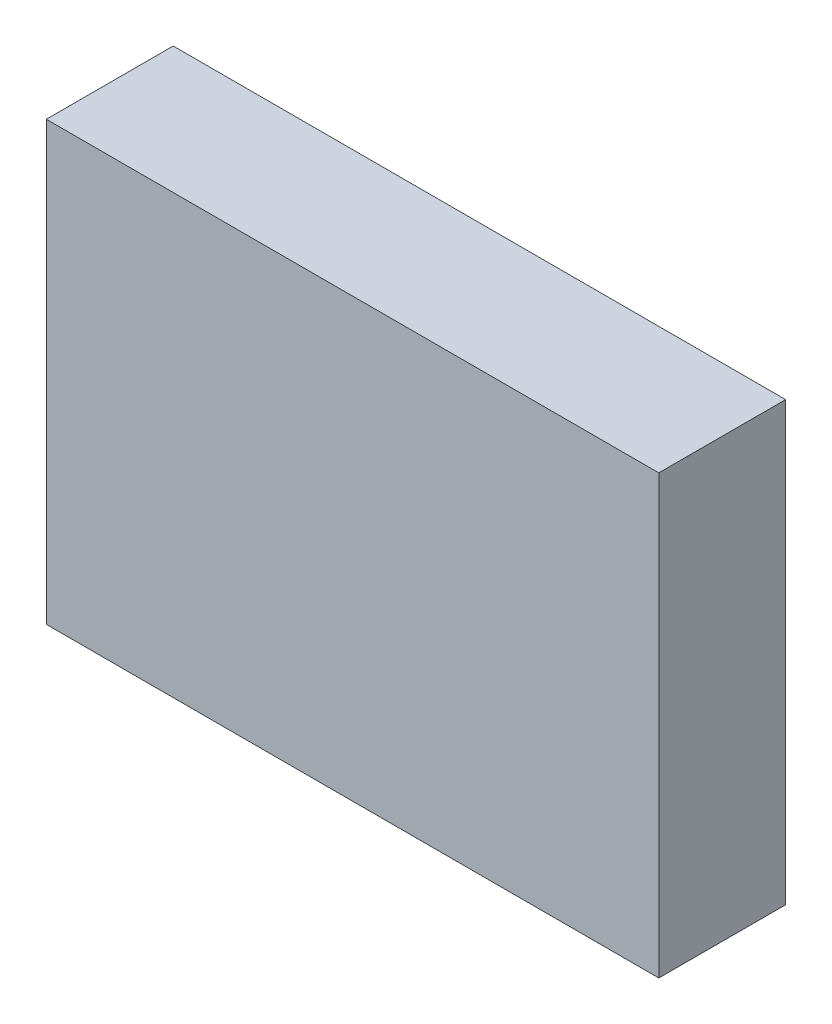
ISO-10303-21;
HEADER;
FILE_DESCRIPTION(('STEP AP214'),'2;1');
FILE_NAME('part.step','',(''),(''),'','','');
FILE_SCHEMA(('AUTOMOTIVE_DESIGN { 1 0 10303 214 1 1 1 1 }'));
ENDSEC;
DATA;
#1=APPLICATION_CONTEXT('core data for automotive mechanical design processes');
#2=APPLICATION_PROTOCOL_DEFINITION('international standard','automotive_design',2000,#1);
#3=PRODUCT_CONTEXT('',#1,'mechanical');
#4=PRODUCT('Part','Part','',(#3));
#5=PRODUCT_RELATED_PRODUCT_CATEGORY('part','',(#4));
#6=PRODUCT_DEFINITION_FORMATION('','',#4);
#7=PRODUCT_DEFINITION_CONTEXT('part definition',#1,'design');
#8=PRODUCT_DEFINITION('design','',#6,#7);
#9=PRODUCT_DEFINITION_SHAPE('','',#8);
#10=(LENGTH_UNIT() NAMED_UNIT(*) SI_UNIT(.MILLI.,.METRE.));
#11=(NAMED_UNIT(*) PLANE_ANGLE_UNIT() SI_UNIT($,.RADIAN.));
#12=(NAMED_UNIT(*) SI_UNIT($,.STERADIAN.) SOLID_ANGLE_UNIT());
#13=UNCERTAINTY_MEASURE_WITH_UNIT(LENGTH_MEASURE(1.E-05),#10,'distance_accuracy_value','');
#14=(GEOMETRIC_REPRESENTATION_CONTEXT(3) GLOBAL_UNCERTAINTY_ASSIGNED_CONTEXT((#13)) GLOBAL_UNIT_ASSIGNED_CONTEXT((#10,
#11,#12)) REPRESENTATION_CONTEXT('',''));
#15=CARTESIAN_POINT('',(0.,0.,0.));
#16=DIRECTION('',(0.,0.,1.));
#17=DIRECTION('',(1.,0.,0.));
#18=AXIS2_PLACEMENT_3D('',#15,#16,#17);
#19=CARTESIAN_POINT('',(-5.52112676056338,2.11424100156494,2.9));
#20=DIRECTION('',(1.,0.,0.));
#21=DIRECTION('',(0.,0.,-1.));
#22=AXIS2_PLACEMENT_3D('',#19,#20,#21);
#23=PLANE('',#22);
#24=DIRECTION('',(0.,-1.,0.));
#25=VECTOR('',#24,1.);
#26=CARTESIAN_POINT('',(-5.52112676056338,2.11424100156494,0.));
#27=LINE('',#26,#25);
#28=CARTESIAN_POINT('',(-5.52112676056338,2.11424100156494,0.));
#29=VERTEX_POINT('',#28);
#30=CARTESIAN_POINT('',(-5.52112676056338,-7.88575899843506,0.));
#31=VERTEX_POINT('',#30);
#32=EDGE_CURVE('E96',#29,#31,#27,.T.);
#33=ORIENTED_EDGE('',*,*,#32,.T.);
#34=DIRECTION('',(0.,0.,-1.));
#35=VECTOR('',#34,1.);
#36=CARTESIAN_POINT('',(-5.52112676056338,-7.88575899843506,2.9));
#37=LINE('',#36,#35);
#38=CARTESIAN_POINT('',(-5.52112676056338,-7.88575899843506,2.9));
#39=VERTEX_POINT('',#38);
#40=EDGE_CURVE('E11',#39,#31,#37,.T.);
#41=ORIENTED_EDGE('',*,*,#40,.F.);
#42=DIRECTION('',(0.,-1.,0.));
#43=VECTOR('',#42,1.);
#44=CARTESIAN_POINT('',(-5.52112676056338,2.11424100156494,2.9));
#45=LINE('',#44,#43);
#46=CARTESIAN_POINT('',(-5.52112676056338,2.11424100156494,2.9));
#47=VERTEX_POINT('',#46);
#48=EDGE_CURVE('E84',#47,#39,#45,.T.);
#49=ORIENTED_EDGE('',*,*,#48,.F.);
#50=DIRECTION('',(0.,0.,-1.));
#51=VECTOR('',#50,1.);
#52=CARTESIAN_POINT('',(-5.52112676056338,2.11424100156494,2.9));
#53=LINE('',#52,#51);
#54=EDGE_CURVE('E92',#47,#29,#53,.T.);
#55=ORIENTED_EDGE('',*,*,#54,.T.);
#56=EDGE_LOOP('',(#33,#41,#49,#55));
#57=FACE_BOUND('',#56,.T.);
#58=ADVANCED_FACE('F33',(#57),#23,.F.);
#59=CARTESIAN_POINT('',(-5.52112676056338,-7.88575899843506,2.9));
#60=DIRECTION('',(0.,1.,0.));
#61=DIRECTION('',(0.,0.,1.));
#62=AXIS2_PLACEMENT_3D('',#59,#60,#61);
#63=PLANE('',#62);
#64=DIRECTION('',(1.,0.,0.));
#65=VECTOR('',#64,1.);
#66=CARTESIAN_POINT('',(-5.52112676056338,-7.88575899843506,0.));
#67=LINE('',#66,#65);
#68=CARTESIAN_POINT('',(8.47887323943662,-7.88575899843506,0.));
#69=VERTEX_POINT('',#68);
#70=EDGE_CURVE('E88',#31,#69,#67,.T.);
#71=ORIENTED_EDGE('',*,*,#70,.T.);
#72=DIRECTION('',(0.,0.,-1.));
#73=VECTOR('',#72,1.);
#74=CARTESIAN_POINT('',(8.47887323943662,-7.88575899843506,2.9));
#75=LINE('',#74,#73);
#76=CARTESIAN_POINT('',(8.47887323943662,-7.88575899843506,2.9));
#77=VERTEX_POINT('',#76);
#78=EDGE_CURVE('E41',#77,#69,#75,.T.);
#79=ORIENTED_EDGE('',*,*,#78,.F.);
#80=DIRECTION('',(1.,0.,0.));
#81=VECTOR('',#80,1.);
#82=CARTESIAN_POINT('',(-5.52112676056338,-7.88575899843506,2.9));
#83=LINE('',#82,#81);
#84=EDGE_CURVE('E79',#39,#77,#83,.T.);
#85=ORIENTED_EDGE('',*,*,#84,.F.);
#86=ORIENTED_EDGE('',*,*,#40,.T.);
#87=EDGE_LOOP('',(#71,#79,#85,#86));
#88=FACE_BOUND('',#87,.T.);
#89=ADVANCED_FACE('F87',(#88),#63,.F.);
#90=CARTESIAN_POINT('',(8.47887323943662,2.11424100156494,2.9));
#91=DIRECTION('',(-1.,0.,0.));
#92=DIRECTION('',(0.,0.,1.));
#93=AXIS2_PLACEMENT_3D('',#90,#91,#92);
#94=PLANE('',#93);
#95=DIRECTION('',(0.,1.,0.));
#96=VECTOR('',#95,1.);
#97=CARTESIAN_POINT('',(8.47887323943662,2.11424100156494,0.));
#98=LINE('',#97,#96);
#99=CARTESIAN_POINT('',(8.47887323943662,2.11424100156494,0.));
#100=VERTEX_POINT('',#99);
#101=EDGE_CURVE('E66',#69,#100,#98,.T.);
#102=ORIENTED_EDGE('',*,*,#101,.T.);
#103=DIRECTION('',(0.,0.,-1.));
#104=VECTOR('',#103,1.);
#105=CARTESIAN_POINT('',(8.47887323943662,2.11424100156494,2.9));
#106=LINE('',#105,#104);
#107=CARTESIAN_POINT('',(8.47887323943662,2.11424100156494,2.9));
#108=VERTEX_POINT('',#107);
#109=EDGE_CURVE('E89',#108,#100,#106,.T.);
#110=ORIENTED_EDGE('',*,*,#109,.F.);
#111=DIRECTION('',(0.,1.,0.));
#112=VECTOR('',#111,1.);
#113=CARTESIAN_POINT('',(8.47887323943662,2.11424100156494,2.9));
#114=LINE('',#113,#112);
#115=EDGE_CURVE('E82',#77,#108,#114,.T.);
#116=ORIENTED_EDGE('',*,*,#115,.F.);
#117=ORIENTED_EDGE('',*,*,#78,.T.);
#118=EDGE_LOOP('',(#102,#110,#116,#117));
#119=FACE_BOUND('',#118,.T.);
#120=ADVANCED_FACE('F90',(#119),#94,.F.);
#121=CARTESIAN_POINT('',(-5.52112676056338,2.11424100156494,2.9));
#122=DIRECTION('',(0.,-1.,0.));
#123=DIRECTION('',(0.,0.,-1.));
#124=AXIS2_PLACEMENT_3D('',#121,#122,#123);
#125=PLANE('',#124);
#126=DIRECTION('',(-1.,0.,0.));
#127=VECTOR('',#126,1.);
#128=CARTESIAN_POINT('',(-5.52112676056338,2.11424100156494,0.));
#129=LINE('',#128,#127);
#130=EDGE_CURVE('E72',#100,#29,#129,.T.);
#131=ORIENTED_EDGE('',*,*,#130,.T.);
#132=ORIENTED_EDGE('',*,*,#54,.F.);
#133=DIRECTION('',(-1.,0.,0.));
#134=VECTOR('',#133,1.);
#135=CARTESIAN_POINT('',(-5.52112676056338,2.11424100156494,2.9));
#136=LINE('',#135,#134);
#137=EDGE_CURVE('E49',#108,#47,#136,.T.);
#138=ORIENTED_EDGE('',*,*,#137,.F.);
#139=ORIENTED_EDGE('',*,*,#109,.T.);
#140=EDGE_LOOP('',(#131,#132,#138,#139));
#141=FACE_BOUND('',#140,.T.);
#142=ADVANCED_FACE('F103',(#141),#125,.F.);
#143=CARTESIAN_POINT('',(0.,0.,2.9));
#144=DIRECTION('',(0.,0.,1.));
#145=DIRECTION('',(1.,0.,0.));
#146=AXIS2_PLACEMENT_3D('',#143,#144,#145);
#147=PLANE('',#146);
#148=ORIENTED_EDGE('',*,*,#48,.T.);
#149=ORIENTED_EDGE('',*,*,#84,.T.);
#150=ORIENTED_EDGE('',*,*,#115,.T.);
#151=ORIENTED_EDGE('',*,*,#137,.T.);
#152=EDGE_LOOP('',(#148,#149,#150,#151));
#153=FACE_BOUND('',#152,.T.);
#154=ADVANCED_FACE('F80',(#153),#147,.T.);
#155=CARTESIAN_POINT('',(0.,0.,0.));
#156=DIRECTION('',(0.,0.,1.));
#157=DIRECTION('',(1.,0.,0.));
#158=AXIS2_PLACEMENT_3D('',#155,#156,#157);
#159=PLANE('',#158);
#160=ORIENTED_EDGE('',*,*,#32,.F.);
#161=ORIENTED_EDGE('',*,*,#130,.F.);
#162=ORIENTED_EDGE('',*,*,#101,.F.);
#163=ORIENTED_EDGE('',*,*,#70,.F.);
#164=EDGE_LOOP('',(#160,#161,#162,#163));
#165=FACE_BOUND('',#164,.T.);
#166=ADVANCED_FACE('F106',(#165),#159,.F.);
#167=CLOSED_SHELL('',(#58,#89,#120,#142,#154,#166));
#168=MANIFOLD_SOLID_BREP('B2',#167);
#169=ADVANCED_BREP_SHAPE_REPRESENTATION('',(#18,#168),#14);
#170=SHAPE_DEFINITION_REPRESENTATION(#9,#169);
ENDSEC;
END-ISO-10303-21;
